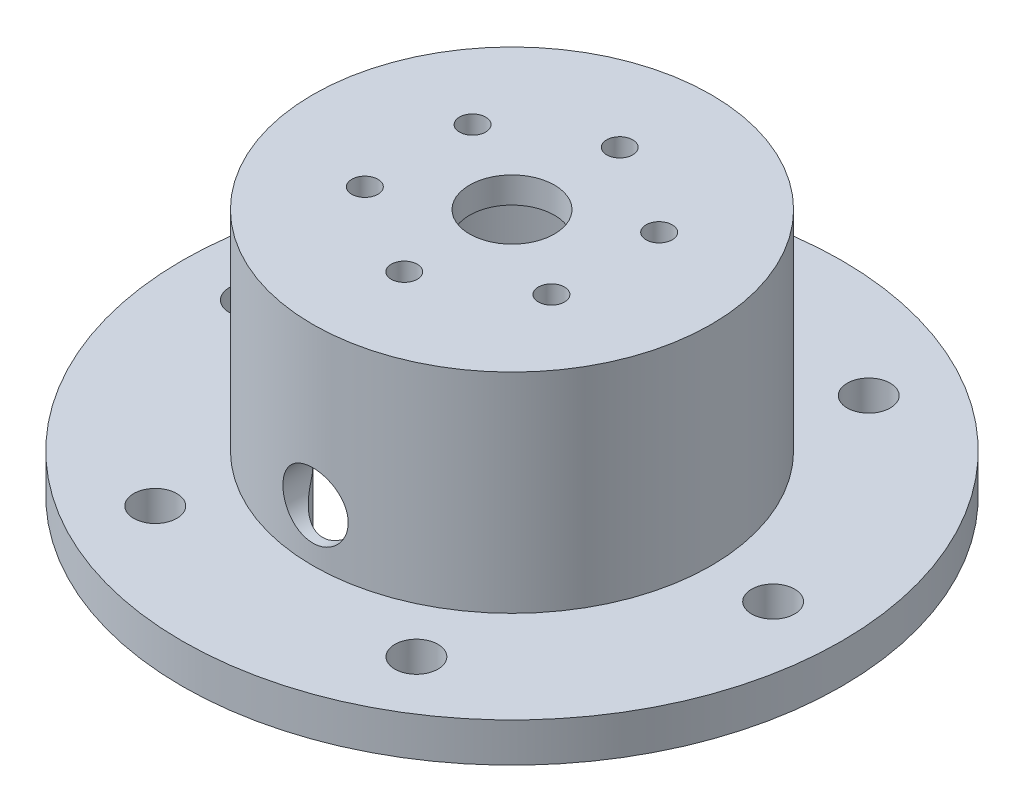
ISO-10303-21;
HEADER;
FILE_DESCRIPTION(('STEP AP214'),'2;1');
FILE_NAME('part.step','',(''),(''),'','','');
FILE_SCHEMA(('AUTOMOTIVE_DESIGN { 1 0 10303 214 1 1 1 1 }'));
ENDSEC;
DATA;
#1=APPLICATION_CONTEXT('core data for automotive mechanical design processes');
#2=APPLICATION_PROTOCOL_DEFINITION('international standard','automotive_design',2000,#1);
#3=PRODUCT_CONTEXT('',#1,'mechanical');
#4=PRODUCT('Part','Part','',(#3));
#5=PRODUCT_RELATED_PRODUCT_CATEGORY('part','',(#4));
#6=PRODUCT_DEFINITION_FORMATION('','',#4);
#7=PRODUCT_DEFINITION_CONTEXT('part definition',#1,'design');
#8=PRODUCT_DEFINITION('design','',#6,#7);
#9=PRODUCT_DEFINITION_SHAPE('','',#8);
#10=(LENGTH_UNIT() NAMED_UNIT(*) SI_UNIT(.MILLI.,.METRE.));
#11=(NAMED_UNIT(*) PLANE_ANGLE_UNIT() SI_UNIT($,.RADIAN.));
#12=(NAMED_UNIT(*) SI_UNIT($,.STERADIAN.) SOLID_ANGLE_UNIT());
#13=UNCERTAINTY_MEASURE_WITH_UNIT(LENGTH_MEASURE(1.E-05),#10,'distance_accuracy_value','');
#14=(GEOMETRIC_REPRESENTATION_CONTEXT(3) GLOBAL_UNCERTAINTY_ASSIGNED_CONTEXT((#13)) GLOBAL_UNIT_ASSIGNED_CONTEXT((#10,
#11,#12)) REPRESENTATION_CONTEXT('',''));
#15=CARTESIAN_POINT('',(0.,0.,0.));
#16=DIRECTION('',(0.,0.,1.));
#17=DIRECTION('',(1.,0.,0.));
#18=AXIS2_PLACEMENT_3D('',#15,#16,#17);
#19=CARTESIAN_POINT('',(0.,-8.78125000000001,0.));
#20=DIRECTION('',(0.,-1.,0.));
#21=DIRECTION('',(0.,0.,-1.));
#22=AXIS2_PLACEMENT_3D('',#19,#20,#21);
#23=CYLINDRICAL_SURFACE('',#22,15.25);
#24=CARTESIAN_POINT('',(0.,-5.5,0.));
#25=DIRECTION('',(0.,-1.,0.));
#26=DIRECTION('',(0.,0.,-1.));
#27=AXIS2_PLACEMENT_3D('',#24,#25,#26);
#28=CIRCLE('',#27,15.25);
#29=CARTESIAN_POINT('',(0.,-5.5,-15.25));
#30=VERTEX_POINT('',#29);
#31=EDGE_CURVE('E203',#30,#30,#28,.T.);
#32=ORIENTED_EDGE('',*,*,#31,.F.);
#33=EDGE_LOOP('',(#32));
#34=FACE_BOUND('',#33,.T.);
#35=CARTESIAN_POINT('',(0.,10.5,0.));
#36=DIRECTION('',(0.,-1.,0.));
#37=DIRECTION('',(0.,0.,-1.));
#38=AXIS2_PLACEMENT_3D('',#35,#36,#37);
#39=CIRCLE('',#38,15.25);
#40=CARTESIAN_POINT('',(0.,10.5,-15.25));
#41=VERTEX_POINT('',#40);
#42=EDGE_CURVE('E207',#41,#41,#39,.T.);
#43=ORIENTED_EDGE('',*,*,#42,.T.);
#44=EDGE_LOOP('',(#43));
#45=FACE_BOUND('',#44,.T.);
#46=CARTESIAN_POINT('',(-2.5,-1.5,15.0436863833304));
#47=CARTESIAN_POINT('',(-2.49999436889565,-1.36058996622969,15.0436888715291));
#48=CARTESIAN_POINT('',(-2.48829942423912,-1.22110298129269,15.0456452510416));
#49=CARTESIAN_POINT('',(-2.44184762292878,-0.946040401480073,15.0532525701983));
#50=CARTESIAN_POINT('',(-2.40706928890944,-0.810468572063246,15.0589069504835));
#51=CARTESIAN_POINT('',(-2.31552901295923,-0.547256998718041,15.0732530335271));
#52=CARTESIAN_POINT('',(-2.2587851865163,-0.419610818712108,15.0819422328191));
#53=CARTESIAN_POINT('',(-2.12496938402168,-0.17566552473177,15.1013759391912));
#54=CARTESIAN_POINT('',(-2.04789978249932,-0.0593650874800335,15.1121202061508));
#55=CARTESIAN_POINT('',(-1.87483569025007,0.159711486861906,15.1345679860233));
#56=CARTESIAN_POINT('',(-1.77868524100701,0.262363679005608,15.146278905572));
#57=CARTESIAN_POINT('',(-1.57052580853765,0.450153707589076,15.1692746165885));
#58=CARTESIAN_POINT('',(-1.45851589793393,0.535290519107398,15.1805593830882));
#59=CARTESIAN_POINT('',(-1.22101550420704,0.686096941257241,15.201509533958));
#60=CARTESIAN_POINT('',(-1.09545097283345,0.751651400947113,15.2111651995828));
#61=CARTESIAN_POINT('',(-0.834907894641405,0.86069232466309,15.2276868590877));
#62=CARTESIAN_POINT('',(-0.699929940845753,0.904180177406113,15.2345530285136));
#63=CARTESIAN_POINT('',(-0.425671427665323,0.967474896221933,15.2446697835583));
#64=CARTESIAN_POINT('',(-0.286440094823517,0.987489903632927,15.2479521298532));
#65=CARTESIAN_POINT('',(-0.00655927461231981,1.00391785068276,15.2506404830936));
#66=CARTESIAN_POINT('',(0.134090118751873,1.00033234469361,15.2500467453249));
#67=CARTESIAN_POINT('',(0.411391944086977,0.969823696491157,15.2450750106367));
#68=CARTESIAN_POINT('',(0.548069763342836,0.943124542232166,15.240733335087));
#69=CARTESIAN_POINT('',(0.814978708892734,0.867498999726815,15.2287940466321));
#70=CARTESIAN_POINT('',(0.945209643751341,0.818571951878227,15.221196337106));
#71=CARTESIAN_POINT('',(1.19619618959688,0.699655736846042,15.2035367187676));
#72=CARTESIAN_POINT('',(1.3169071190836,0.629573933518881,15.1934640088286));
#73=CARTESIAN_POINT('',(1.54494009188738,0.470405400765909,15.171974083687));
#74=CARTESIAN_POINT('',(1.65226108495578,0.381317182042463,15.1605567631554));
#75=CARTESIAN_POINT('',(1.85179060195157,0.185421439999782,15.1374897684758));
#76=CARTESIAN_POINT('',(1.94380692799787,0.0784181835354853,15.1258389400893));
#77=CARTESIAN_POINT('',(2.10860979061517,-0.149609767352113,15.1037478707327));
#78=CARTESIAN_POINT('',(2.18139616079641,-0.270634583085807,15.093307640238));
#79=CARTESIAN_POINT('',(2.30570873414623,-0.523489246494777,15.0748194098191));
#80=CARTESIAN_POINT('',(2.35721237516533,-0.655330384225065,15.0667739511428));
#81=CARTESIAN_POINT('',(2.43728923713707,-0.925953897143515,15.0540287328452));
#82=CARTESIAN_POINT('',(2.46586440749228,-1.06473568116462,15.049328688797));
#83=CARTESIAN_POINT('',(2.49900375018269,-1.34358297133288,15.0438613069689));
#84=CARTESIAN_POINT('',(2.50384164158102,-1.48361509741253,15.0430491400149));
#85=CARTESIAN_POINT('',(2.49009798194966,-1.76248861370057,15.045330129843));
#86=CARTESIAN_POINT('',(2.47151730483556,-1.90133004814759,15.0484231408949));
#87=CARTESIAN_POINT('',(2.41169711181135,-2.1730151717221,15.0581246046451));
#88=CARTESIAN_POINT('',(2.37059641649807,-2.30589026393369,15.0647115119862));
#89=CARTESIAN_POINT('',(2.26704827509519,-2.56286646578566,15.0806405632024));
#90=CARTESIAN_POINT('',(2.20459958947363,-2.68696706544612,15.0899828670601));
#91=CARTESIAN_POINT('',(2.05948015817447,-2.92409123313138,15.1104744800114));
#92=CARTESIAN_POINT('',(1.976633701866,-3.03700591200682,15.121639189897));
#93=CARTESIAN_POINT('',(1.79331213199657,-3.24742834826989,15.1444723610906));
#94=CARTESIAN_POINT('',(1.69283582035502,-3.34493505771427,15.1561408565939));
#95=CARTESIAN_POINT('',(1.47589522888507,-3.5227703929993,15.1788083647533));
#96=CARTESIAN_POINT('',(1.35928052089206,-3.60291667117805,15.1897994771961));
#97=CARTESIAN_POINT('',(1.11408312890344,-3.74248000300532,15.2097477606053));
#98=CARTESIAN_POINT('',(0.985500822384892,-3.8018977101854,15.2187049956929));
#99=CARTESIAN_POINT('',(0.720564626536504,-3.89803218944689,15.2335419023291));
#100=CARTESIAN_POINT('',(0.584246386342421,-3.93484511147779,15.2394345923668));
#101=CARTESIAN_POINT('',(0.307258234990384,-3.9850349186343,15.2475334351947));
#102=CARTESIAN_POINT('',(0.166588670666615,-3.99841366677137,15.2497398810398));
#103=CARTESIAN_POINT('',(-0.1133475924258,-4.00130313113405,15.2502136927576));
#104=CARTESIAN_POINT('',(-0.252611425539534,-3.99109155755358,15.2485268909664));
#105=CARTESIAN_POINT('',(-0.527412134154975,-3.94768999727634,15.2414971045484));
#106=CARTESIAN_POINT('',(-0.662949028887985,-3.91450012917256,15.2361541387914));
#107=CARTESIAN_POINT('',(-0.926347478650721,-3.82618933835013,15.2224101182014));
#108=CARTESIAN_POINT('',(-1.0542168780381,-3.77109128542064,15.2140122531306));
#109=CARTESIAN_POINT('',(-1.29893912405276,-3.64055884010791,15.1950761389678));
#110=CARTESIAN_POINT('',(-1.41579147570313,-3.56512353459419,15.1845377937748));
#111=CARTESIAN_POINT('',(-1.6365632571551,-3.3950700154789,15.1623423178756));
#112=CARTESIAN_POINT('',(-1.74032471080974,-3.30024813966821,15.1506740657498));
#113=CARTESIAN_POINT('',(-1.93056179840912,-3.09454084298458,15.127611755094));
#114=CARTESIAN_POINT('',(-2.01703337766477,-2.9836516646215,15.1162177614307));
#115=CARTESIAN_POINT('',(-2.1707759377247,-2.74806100641487,15.0949102160576));
#116=CARTESIAN_POINT('',(-2.23791198284988,-2.62327050516041,15.0850072881624));
#117=CARTESIAN_POINT('',(-2.35016654005215,-2.36407333255384,15.0679284794768));
#118=CARTESIAN_POINT('',(-2.39530719424081,-2.22967648860596,15.0607498578247));
#119=CARTESIAN_POINT('',(-2.45241030429398,-1.99561843946267,15.0515359076239));
#120=CARTESIAN_POINT('',(-2.4702280370176,-1.89737953492528,15.0486085721035));
#121=CARTESIAN_POINT('',(-2.49402479746069,-1.69944019949075,15.0446829364593));
#122=CARTESIAN_POINT('',(-2.50000402872857,-1.59973979375201,15.0436846031685));
#123=CARTESIAN_POINT('',(-2.5,-1.5,15.0436863833304));
#124=B_SPLINE_CURVE_WITH_KNOTS('',3,(#46,#47,#48,#49,#50,#51,#52,#53,#54,#55,#56,#57,#58,#59,
#60,#61,#62,#63,#64,#65,#66,#67,#68,#69,#70,#71,#72,#73,#74,#75,#76,#77,#78,#79,#80,#81,#82,#83,
#84,#85,#86,#87,#88,#89,#90,#91,#92,#93,#94,#95,#96,#97,#98,#99,#100,#101,#102,#103,#104,#105,
#106,#107,#108,#109,#110,#111,#112,#113,#114,#115,#116,#117,#118,#119,#120,#121,#122,#123),
.UNSPECIFIED.,.T.,.F.,(4,2,2,2,2,2,2,2,2,2,2,2,2,2,2,2,2,2,2,2,2,2,2,2,2,2,2,2,2,2,2,2,2,2,2,2,
2,2,4),(0.,0.417865400343386,0.836120139194291,1.25403066535855,1.67189239133825,
2.09332172555459,2.51477571291411,2.93866129896237,3.36252020532592,3.78259149670449,
4.20263512171375,4.6186532153536,5.03468365494004,5.45256298124069,5.87047506360856,
6.29329309485534,6.71611478447214,7.1393835710122,7.56261636698263,7.98095712600443,
8.39928227417968,8.81505727870983,9.23085642855569,9.65037100640883,10.0699141044662,
10.4936705305046,10.9174135951187,11.3393415427163,11.7612359456162,12.1781890678994,
12.595140038267,13.0116568945588,13.4281924553239,13.8493521868335,14.2706105699595,
14.6947412241392,15.1184440318466,15.4174076310667,15.7163660899322),.UNSPECIFIED.);
#125=CARTESIAN_POINT('',(-2.5,-1.5,15.0436863833304));
#126=VERTEX_POINT('',#125);
#127=EDGE_CURVE('E106',#126,#126,#124,.T.);
#128=ORIENTED_EDGE('',*,*,#127,.T.);
#129=EDGE_LOOP('',(#128));
#130=FACE_BOUND('',#129,.T.);
#131=ADVANCED_FACE('F39',(#34,#45,#130),#23,.T.);
#132=CARTESIAN_POINT('',(0.,-8.78125000000001,0.));
#133=DIRECTION('',(0.,-1.,0.));
#134=DIRECTION('',(0.,0.,-1.));
#135=AXIS2_PLACEMENT_3D('',#132,#133,#134);
#136=CYLINDRICAL_SURFACE('',#135,13.);
#137=DIRECTION('',(0.,-1.,0.));
#138=VECTOR('',#137,1.);
#139=CARTESIAN_POINT('',(2.5,1.5,12.7573508221731));
#140=LINE('',#139,#138);
#141=CARTESIAN_POINT('',(2.5,-1.5,12.7573508221731));
#142=VERTEX_POINT('',#141);
#143=CARTESIAN_POINT('',(2.5,-8.5,12.7573508221731));
#144=VERTEX_POINT('',#143);
#145=EDGE_CURVE('E63',#142,#144,#140,.T.);
#146=ORIENTED_EDGE('',*,*,#145,.F.);
#147=CARTESIAN_POINT('',(2.5,1.5,12.7573508221731));
#148=VERTEX_POINT('',#147);
#149=EDGE_CURVE('E98',#148,#142,#140,.T.);
#150=ORIENTED_EDGE('',*,*,#149,.F.);
#151=CARTESIAN_POINT('',(0.,1.5,0.));
#152=DIRECTION('',(0.,1.,0.));
#153=DIRECTION('',(0.,0.,-1.));
#154=AXIS2_PLACEMENT_3D('',#151,#152,#153);
#155=CIRCLE('',#154,13.);
#156=CARTESIAN_POINT('',(-2.5,1.5,12.7573508221731));
#157=VERTEX_POINT('',#156);
#158=EDGE_CURVE('E91',#157,#148,#155,.T.);
#159=ORIENTED_EDGE('',*,*,#158,.F.);
#160=DIRECTION('',(0.,-1.,0.));
#161=VECTOR('',#160,1.);
#162=CARTESIAN_POINT('',(-2.5,1.5,12.7573508221731));
#163=LINE('',#162,#161);
#164=CARTESIAN_POINT('',(-2.5,-1.5,12.7573508221731));
#165=VERTEX_POINT('',#164);
#166=EDGE_CURVE('E77',#157,#165,#163,.T.);
#167=ORIENTED_EDGE('',*,*,#166,.T.);
#168=CARTESIAN_POINT('',(-2.5,-8.5,12.7573508221731));
#169=VERTEX_POINT('',#168);
#170=EDGE_CURVE('E87',#165,#169,#163,.T.);
#171=ORIENTED_EDGE('',*,*,#170,.T.);
#172=CARTESIAN_POINT('',(0.,-8.5,0.));
#173=DIRECTION('',(0.,-1.,0.));
#174=DIRECTION('',(0.,0.,-1.));
#175=AXIS2_PLACEMENT_3D('',#172,#173,#174);
#176=CIRCLE('',#175,13.);
#177=EDGE_CURVE('E262',#169,#144,#176,.T.);
#178=ORIENTED_EDGE('',*,*,#177,.T.);
#179=EDGE_LOOP('',(#146,#150,#159,#167,#171,#178));
#180=FACE_BOUND('',#179,.T.);
#181=CARTESIAN_POINT('',(0.,8.5,0.));
#182=DIRECTION('',(0.,-1.,0.));
#183=DIRECTION('',(0.,0.,-1.));
#184=AXIS2_PLACEMENT_3D('',#181,#182,#183);
#185=CIRCLE('',#184,13.);
#186=CARTESIAN_POINT('',(0.,8.5,-13.));
#187=VERTEX_POINT('',#186);
#188=EDGE_CURVE('E260',#187,#187,#185,.T.);
#189=ORIENTED_EDGE('',*,*,#188,.F.);
#190=EDGE_LOOP('',(#189));
#191=FACE_BOUND('',#190,.T.);
#192=ADVANCED_FACE('F96',(#180,#191),#136,.F.);
#193=CARTESIAN_POINT('',(13.,8.5,0.));
#194=DIRECTION('',(0.,-1.,0.));
#195=DIRECTION('',(0.,0.,-1.));
#196=AXIS2_PLACEMENT_3D('',#193,#194,#195);
#197=PLANE('',#196);
#198=CARTESIAN_POINT('',(7.14470958122166,8.5,4.12499999999993));
#199=DIRECTION('',(0.,-1.,0.));
#200=DIRECTION('',(0.,0.,-1.));
#201=AXIS2_PLACEMENT_3D('',#198,#199,#200);
#202=CIRCLE('',#201,1.);
#203=CARTESIAN_POINT('',(7.14470958122166,8.5,3.12499999999993));
#204=VERTEX_POINT('',#203);
#205=EDGE_CURVE('E237',#204,#204,#202,.T.);
#206=ORIENTED_EDGE('',*,*,#205,.F.);
#207=EDGE_LOOP('',(#206));
#208=FACE_BOUND('',#207,.T.);
#209=CARTESIAN_POINT('',(7.14470958122157,8.5,-4.12500000000008));
#210=DIRECTION('',(0.,-1.,0.));
#211=DIRECTION('',(0.,0.,-1.));
#212=AXIS2_PLACEMENT_3D('',#209,#210,#211);
#213=CIRCLE('',#212,1.);
#214=CARTESIAN_POINT('',(7.14470958122157,8.5,-5.12500000000008));
#215=VERTEX_POINT('',#214);
#216=EDGE_CURVE('E241',#215,#215,#213,.T.);
#217=ORIENTED_EDGE('',*,*,#216,.F.);
#218=EDGE_LOOP('',(#217));
#219=FACE_BOUND('',#218,.T.);
#220=CARTESIAN_POINT('',(-7.1447095812216,8.5,4.12500000000003));
#221=DIRECTION('',(0.,-1.,0.));
#222=DIRECTION('',(0.,0.,-1.));
#223=AXIS2_PLACEMENT_3D('',#220,#221,#222);
#224=CIRCLE('',#223,1.);
#225=CARTESIAN_POINT('',(-7.1447095812216,8.5,3.12500000000003));
#226=VERTEX_POINT('',#225);
#227=EDGE_CURVE('E245',#226,#226,#224,.T.);
#228=ORIENTED_EDGE('',*,*,#227,.F.);
#229=EDGE_LOOP('',(#228));
#230=FACE_BOUND('',#229,.T.);
#231=CARTESIAN_POINT('',(0.,8.5,8.25));
#232=DIRECTION('',(0.,-1.,0.));
#233=DIRECTION('',(0.,0.,-1.));
#234=AXIS2_PLACEMENT_3D('',#231,#232,#233);
#235=CIRCLE('',#234,1.);
#236=CARTESIAN_POINT('',(0.,8.5,7.25));
#237=VERTEX_POINT('',#236);
#238=EDGE_CURVE('E249',#237,#237,#235,.T.);
#239=ORIENTED_EDGE('',*,*,#238,.F.);
#240=EDGE_LOOP('',(#239));
#241=FACE_BOUND('',#240,.T.);
#242=CARTESIAN_POINT('',(-7.14470958122163,8.5,-4.12499999999998));
#243=DIRECTION('',(0.,-1.,0.));
#244=DIRECTION('',(0.,0.,-1.));
#245=AXIS2_PLACEMENT_3D('',#242,#243,#244);
#246=CIRCLE('',#245,1.);
#247=CARTESIAN_POINT('',(-7.14470958122163,8.5,-5.12499999999998));
#248=VERTEX_POINT('',#247);
#249=EDGE_CURVE('E253',#248,#248,#246,.T.);
#250=ORIENTED_EDGE('',*,*,#249,.F.);
#251=EDGE_LOOP('',(#250));
#252=FACE_BOUND('',#251,.T.);
#253=CARTESIAN_POINT('',(0.,8.5,-8.25));
#254=DIRECTION('',(0.,-1.,0.));
#255=DIRECTION('',(0.,0.,-1.));
#256=AXIS2_PLACEMENT_3D('',#253,#254,#255);
#257=CIRCLE('',#256,1.);
#258=CARTESIAN_POINT('',(0.,8.5,-9.25));
#259=VERTEX_POINT('',#258);
#260=EDGE_CURVE('E257',#259,#259,#257,.T.);
#261=ORIENTED_EDGE('',*,*,#260,.F.);
#262=EDGE_LOOP('',(#261));
#263=FACE_BOUND('',#262,.T.);
#264=ORIENTED_EDGE('',*,*,#188,.T.);
#265=EDGE_LOOP('',(#264));
#266=FACE_BOUND('',#265,.T.);
#267=CARTESIAN_POINT('',(0.,8.5,0.));
#268=DIRECTION('',(0.,-1.,0.));
#269=DIRECTION('',(0.,0.,-1.));
#270=AXIS2_PLACEMENT_3D('',#267,#268,#269);
#271=CIRCLE('',#270,3.25);
#272=CARTESIAN_POINT('',(0.,8.5,-3.25));
#273=VERTEX_POINT('',#272);
#274=EDGE_CURVE('E217',#273,#273,#271,.T.);
#275=ORIENTED_EDGE('',*,*,#274,.F.);
#276=EDGE_LOOP('',(#275));
#277=FACE_BOUND('',#276,.T.);
#278=ADVANCED_FACE('F41',(#208,#219,#230,#241,#252,#263,#266,#277),#197,.T.);
#279=CARTESIAN_POINT('',(0.,-8.78125000000001,0.));
#280=DIRECTION('',(0.,-1.,0.));
#281=DIRECTION('',(0.,0.,-1.));
#282=AXIS2_PLACEMENT_3D('',#279,#280,#281);
#283=CYLINDRICAL_SURFACE('',#282,3.25);
#284=ORIENTED_EDGE('',*,*,#274,.T.);
#285=EDGE_LOOP('',(#284));
#286=FACE_BOUND('',#285,.T.);
#287=CARTESIAN_POINT('',(0.,10.5,0.));
#288=DIRECTION('',(0.,-1.,0.));
#289=DIRECTION('',(0.,0.,-1.));
#290=AXIS2_PLACEMENT_3D('',#287,#288,#289);
#291=CIRCLE('',#290,3.25);
#292=CARTESIAN_POINT('',(0.,10.5,-3.25));
#293=VERTEX_POINT('',#292);
#294=EDGE_CURVE('E212',#293,#293,#291,.T.);
#295=ORIENTED_EDGE('',*,*,#294,.F.);
#296=EDGE_LOOP('',(#295));
#297=FACE_BOUND('',#296,.T.);
#298=ADVANCED_FACE('F192',(#286,#297),#283,.F.);
#299=CARTESIAN_POINT('',(3.25,10.5,0.));
#300=DIRECTION('',(0.,1.,0.));
#301=DIRECTION('',(0.,0.,1.));
#302=AXIS2_PLACEMENT_3D('',#299,#300,#301);
#303=PLANE('',#302);
#304=CARTESIAN_POINT('',(7.14470958122166,10.5,4.12499999999993));
#305=DIRECTION('',(0.,1.,0.));
#306=DIRECTION('',(-0.866025403784443,0.,-0.499999999999992));
#307=AXIS2_PLACEMENT_3D('',#304,#305,#306);
#308=CIRCLE('',#307,1.);
#309=CARTESIAN_POINT('',(6.27868417743721,10.5,3.62499999999994));
#310=VERTEX_POINT('',#309);
#311=EDGE_CURVE('E344',#310,#310,#308,.T.);
#312=ORIENTED_EDGE('',*,*,#311,.F.);
#313=EDGE_LOOP('',(#312));
#314=FACE_BOUND('',#313,.T.);
#315=CARTESIAN_POINT('',(7.14470958122157,10.5,-4.12500000000008));
#316=DIRECTION('',(0.,1.,0.));
#317=DIRECTION('',(-0.866025403784433,0.,0.50000000000001));
#318=AXIS2_PLACEMENT_3D('',#315,#316,#317);
#319=CIRCLE('',#318,1.);
#320=CARTESIAN_POINT('',(6.27868417743714,10.5,-3.62500000000007));
#321=VERTEX_POINT('',#320);
#322=EDGE_CURVE('E352',#321,#321,#319,.T.);
#323=ORIENTED_EDGE('',*,*,#322,.F.);
#324=EDGE_LOOP('',(#323));
#325=FACE_BOUND('',#324,.T.);
#326=CARTESIAN_POINT('',(-7.1447095812216,10.5,4.12500000000003));
#327=DIRECTION('',(0.,1.,0.));
#328=DIRECTION('',(0.866025403784436,0.,-0.500000000000004));
#329=AXIS2_PLACEMENT_3D('',#326,#327,#328);
#330=CIRCLE('',#329,1.);
#331=CARTESIAN_POINT('',(-6.27868417743716,10.5,3.62500000000003));
#332=VERTEX_POINT('',#331);
#333=EDGE_CURVE('E328',#332,#332,#330,.T.);
#334=ORIENTED_EDGE('',*,*,#333,.F.);
#335=EDGE_LOOP('',(#334));
#336=FACE_BOUND('',#335,.T.);
#337=CARTESIAN_POINT('',(0.,10.5,8.25));
#338=DIRECTION('',(0.,1.,0.));
#339=DIRECTION('',(0.,0.,-1.));
#340=AXIS2_PLACEMENT_3D('',#337,#338,#339);
#341=CIRCLE('',#340,1.);
#342=CARTESIAN_POINT('',(0.,10.5,7.25));
#343=VERTEX_POINT('',#342);
#344=EDGE_CURVE('E336',#343,#343,#341,.T.);
#345=ORIENTED_EDGE('',*,*,#344,.F.);
#346=EDGE_LOOP('',(#345));
#347=FACE_BOUND('',#346,.T.);
#348=CARTESIAN_POINT('',(-7.14470958122163,10.5,-4.12499999999998));
#349=DIRECTION('',(0.,1.,0.));
#350=DIRECTION('',(0.86602540378444,0.,0.499999999999998));
#351=AXIS2_PLACEMENT_3D('',#348,#349,#350);
#352=CIRCLE('',#351,1.);
#353=CARTESIAN_POINT('',(-6.27868417743719,10.5,-3.62499999999999));
#354=VERTEX_POINT('',#353);
#355=EDGE_CURVE('E323',#354,#354,#352,.T.);
#356=ORIENTED_EDGE('',*,*,#355,.F.);
#357=EDGE_LOOP('',(#356));
#358=FACE_BOUND('',#357,.T.);
#359=CARTESIAN_POINT('',(0.,10.5,-8.25));
#360=DIRECTION('',(0.,1.,0.));
#361=DIRECTION('',(0.,0.,1.));
#362=AXIS2_PLACEMENT_3D('',#359,#360,#361);
#363=CIRCLE('',#362,1.);
#364=CARTESIAN_POINT('',(0.,10.5,-7.25));
#365=VERTEX_POINT('',#364);
#366=EDGE_CURVE('E285',#365,#365,#363,.T.);
#367=ORIENTED_EDGE('',*,*,#366,.F.);
#368=EDGE_LOOP('',(#367));
#369=FACE_BOUND('',#368,.T.);
#370=ORIENTED_EDGE('',*,*,#294,.T.);
#371=EDGE_LOOP('',(#370));
#372=FACE_BOUND('',#371,.T.);
#373=ORIENTED_EDGE('',*,*,#42,.F.);
#374=EDGE_LOOP('',(#373));
#375=FACE_BOUND('',#374,.T.);
#376=ADVANCED_FACE('F187',(#314,#325,#336,#347,#358,#369,#372,#375),#303,.T.);
#377=CARTESIAN_POINT('',(15.25,-5.5,0.));
#378=DIRECTION('',(0.,1.,0.));
#379=DIRECTION('',(0.,0.,1.));
#380=AXIS2_PLACEMENT_3D('',#377,#378,#379);
#381=PLANE('',#380);
#382=CARTESIAN_POINT('',(-20.,-5.5,0.));
#383=DIRECTION('',(0.,1.,0.));
#384=DIRECTION('',(0.,0.,1.));
#385=AXIS2_PLACEMENT_3D('',#382,#383,#384);
#386=CIRCLE('',#385,1.65);
#387=CARTESIAN_POINT('',(-20.,-5.5,1.65));
#388=VERTEX_POINT('',#387);
#389=EDGE_CURVE('E303',#388,#388,#386,.T.);
#390=ORIENTED_EDGE('',*,*,#389,.F.);
#391=EDGE_LOOP('',(#390));
#392=FACE_BOUND('',#391,.T.);
#393=CARTESIAN_POINT('',(-9.99999999999984,-5.5,17.3205080756889));
#394=DIRECTION('',(0.,1.,0.));
#395=DIRECTION('',(0.,0.,1.));
#396=AXIS2_PLACEMENT_3D('',#393,#394,#395);
#397=CIRCLE('',#396,1.65);
#398=CARTESIAN_POINT('',(-9.99999999999984,-5.5,18.9705080756889));
#399=VERTEX_POINT('',#398);
#400=EDGE_CURVE('E307',#399,#399,#397,.T.);
#401=ORIENTED_EDGE('',*,*,#400,.F.);
#402=EDGE_LOOP('',(#401));
#403=FACE_BOUND('',#402,.T.);
#404=CARTESIAN_POINT('',(9.99999999999996,-5.5,-17.3205080756888));
#405=DIRECTION('',(0.,1.,0.));
#406=DIRECTION('',(0.,0.,1.));
#407=AXIS2_PLACEMENT_3D('',#404,#405,#406);
#408=CIRCLE('',#407,1.65);
#409=CARTESIAN_POINT('',(9.99999999999996,-5.5,-15.6705080756888));
#410=VERTEX_POINT('',#409);
#411=EDGE_CURVE('E311',#410,#410,#408,.T.);
#412=ORIENTED_EDGE('',*,*,#411,.F.);
#413=EDGE_LOOP('',(#412));
#414=FACE_BOUND('',#413,.T.);
#415=CARTESIAN_POINT('',(-10.0000000000001,-5.5,-17.3205080756887));
#416=DIRECTION('',(0.,1.,0.));
#417=DIRECTION('',(0.,0.,1.));
#418=AXIS2_PLACEMENT_3D('',#415,#416,#417);
#419=CIRCLE('',#418,1.65);
#420=CARTESIAN_POINT('',(-10.0000000000001,-5.5,-15.6705080756887));
#421=VERTEX_POINT('',#420);
#422=EDGE_CURVE('E315',#421,#421,#419,.T.);
#423=ORIENTED_EDGE('',*,*,#422,.F.);
#424=EDGE_LOOP('',(#423));
#425=FACE_BOUND('',#424,.T.);
#426=CARTESIAN_POINT('',(10.0000000000002,-5.5,17.3205080756887));
#427=DIRECTION('',(0.,1.,0.));
#428=DIRECTION('',(0.,0.,1.));
#429=AXIS2_PLACEMENT_3D('',#426,#427,#428);
#430=CIRCLE('',#429,1.65);
#431=CARTESIAN_POINT('',(10.0000000000002,-5.5,18.9705080756887));
#432=VERTEX_POINT('',#431);
#433=EDGE_CURVE('E319',#432,#432,#430,.T.);
#434=ORIENTED_EDGE('',*,*,#433,.F.);
#435=EDGE_LOOP('',(#434));
#436=FACE_BOUND('',#435,.T.);
#437=CARTESIAN_POINT('',(20.,-5.5,0.));
#438=DIRECTION('',(0.,1.,0.));
#439=DIRECTION('',(0.,0.,1.));
#440=AXIS2_PLACEMENT_3D('',#437,#438,#439);
#441=CIRCLE('',#440,1.65);
#442=CARTESIAN_POINT('',(20.,-5.5,1.65));
#443=VERTEX_POINT('',#442);
#444=EDGE_CURVE('E269',#443,#443,#441,.T.);
#445=ORIENTED_EDGE('',*,*,#444,.F.);
#446=EDGE_LOOP('',(#445));
#447=FACE_BOUND('',#446,.T.);
#448=ORIENTED_EDGE('',*,*,#31,.T.);
#449=EDGE_LOOP('',(#448));
#450=FACE_BOUND('',#449,.T.);
#451=CARTESIAN_POINT('',(0.,-5.5,0.));
#452=DIRECTION('',(0.,-1.,0.));
#453=DIRECTION('',(0.,0.,-1.));
#454=AXIS2_PLACEMENT_3D('',#451,#452,#453);
#455=CIRCLE('',#454,25.25);
#456=CARTESIAN_POINT('',(0.,-5.5,-25.25));
#457=VERTEX_POINT('',#456);
#458=EDGE_CURVE('E219',#457,#457,#455,.T.);
#459=ORIENTED_EDGE('',*,*,#458,.F.);
#460=EDGE_LOOP('',(#459));
#461=FACE_BOUND('',#460,.T.);
#462=ADVANCED_FACE('F184',(#392,#403,#414,#425,#436,#447,#450,#461),#381,.T.);
#463=CARTESIAN_POINT('',(0.,-8.78125000000001,0.));
#464=DIRECTION('',(0.,-1.,0.));
#465=DIRECTION('',(0.,0.,-1.));
#466=AXIS2_PLACEMENT_3D('',#463,#464,#465);
#467=CYLINDRICAL_SURFACE('',#466,25.25);
#468=ORIENTED_EDGE('',*,*,#458,.T.);
#469=EDGE_LOOP('',(#468));
#470=FACE_BOUND('',#469,.T.);
#471=CARTESIAN_POINT('',(0.,-8.5,0.));
#472=DIRECTION('',(0.,-1.,0.));
#473=DIRECTION('',(0.,0.,-1.));
#474=AXIS2_PLACEMENT_3D('',#471,#472,#473);
#475=CIRCLE('',#474,25.25);
#476=CARTESIAN_POINT('',(0.,-8.5,-25.25));
#477=VERTEX_POINT('',#476);
#478=EDGE_CURVE('E267',#477,#477,#475,.T.);
#479=ORIENTED_EDGE('',*,*,#478,.F.);
#480=EDGE_LOOP('',(#479));
#481=FACE_BOUND('',#480,.T.);
#482=ADVANCED_FACE('F181',(#470,#481),#467,.T.);
#483=CARTESIAN_POINT('',(25.25,-8.5,0.));
#484=DIRECTION('',(0.,-1.,0.));
#485=DIRECTION('',(0.,0.,-1.));
#486=AXIS2_PLACEMENT_3D('',#483,#484,#485);
#487=PLANE('',#486);
#488=CARTESIAN_POINT('',(0.,-8.5,11.8354286464699));
#489=DIRECTION('',(0.,-1.,0.));
#490=DIRECTION('',(0.,0.,-1.));
#491=AXIS2_PLACEMENT_3D('',#488,#489,#490);
#492=CIRCLE('',#491,2.66457135353011);
#493=EDGE_CURVE('E94',#144,#169,#492,.T.);
#494=ORIENTED_EDGE('',*,*,#493,.F.);
#495=ORIENTED_EDGE('',*,*,#177,.F.);
#496=EDGE_LOOP('',(#494,#495));
#497=FACE_BOUND('',#496,.T.);
#498=CARTESIAN_POINT('',(-20.,-8.5,0.));
#499=DIRECTION('',(0.,1.,0.));
#500=DIRECTION('',(0.,0.,-1.));
#501=AXIS2_PLACEMENT_3D('',#498,#499,#500);
#502=CIRCLE('',#501,1.65);
#503=CARTESIAN_POINT('',(-20.,-8.5,-1.65));
#504=VERTEX_POINT('',#503);
#505=EDGE_CURVE('E340',#504,#504,#502,.T.);
#506=ORIENTED_EDGE('',*,*,#505,.T.);
#507=EDGE_LOOP('',(#506));
#508=FACE_BOUND('',#507,.T.);
#509=CARTESIAN_POINT('',(-9.99999999999984,-8.5,17.3205080756889));
#510=DIRECTION('',(0.,1.,0.));
#511=DIRECTION('',(-0.866025403784443,0.,-0.499999999999992));
#512=AXIS2_PLACEMENT_3D('',#509,#510,#511);
#513=CIRCLE('',#512,1.65);
#514=CARTESIAN_POINT('',(-11.4289419162442,-8.5,16.4955080756889));
#515=VERTEX_POINT('',#514);
#516=EDGE_CURVE('E348',#515,#515,#513,.T.);
#517=ORIENTED_EDGE('',*,*,#516,.T.);
#518=EDGE_LOOP('',(#517));
#519=FACE_BOUND('',#518,.T.);
#520=CARTESIAN_POINT('',(9.99999999999996,-8.5,-17.3205080756888));
#521=DIRECTION('',(0.,1.,0.));
#522=DIRECTION('',(0.86602540378444,0.,0.499999999999998));
#523=AXIS2_PLACEMENT_3D('',#520,#521,#522);
#524=CIRCLE('',#523,1.65);
#525=CARTESIAN_POINT('',(11.4289419162443,-8.5,-16.4955080756888));
#526=VERTEX_POINT('',#525);
#527=EDGE_CURVE('E327',#526,#526,#524,.T.);
#528=ORIENTED_EDGE('',*,*,#527,.T.);
#529=EDGE_LOOP('',(#528));
#530=FACE_BOUND('',#529,.T.);
#531=CARTESIAN_POINT('',(-10.0000000000001,-8.5,-17.3205080756887));
#532=DIRECTION('',(0.,1.,0.));
#533=DIRECTION('',(0.866025403784436,0.,-0.500000000000004));
#534=AXIS2_PLACEMENT_3D('',#531,#532,#533);
#535=CIRCLE('',#534,1.65);
#536=CARTESIAN_POINT('',(-8.57105808375576,-8.5,-18.1455080756887));
#537=VERTEX_POINT('',#536);
#538=EDGE_CURVE('E332',#537,#537,#535,.T.);
#539=ORIENTED_EDGE('',*,*,#538,.T.);
#540=EDGE_LOOP('',(#539));
#541=FACE_BOUND('',#540,.T.);
#542=CARTESIAN_POINT('',(10.0000000000002,-8.5,17.3205080756887));
#543=DIRECTION('',(0.,1.,0.));
#544=DIRECTION('',(-0.866025403784433,0.,0.50000000000001));
#545=AXIS2_PLACEMENT_3D('',#542,#543,#544);
#546=CIRCLE('',#545,1.65);
#547=CARTESIAN_POINT('',(8.57105808375589,-8.5,18.1455080756887));
#548=VERTEX_POINT('',#547);
#549=EDGE_CURVE('E115',#548,#548,#546,.T.);
#550=ORIENTED_EDGE('',*,*,#549,.T.);
#551=EDGE_LOOP('',(#550));
#552=FACE_BOUND('',#551,.T.);
#553=CARTESIAN_POINT('',(20.,-8.5,0.));
#554=DIRECTION('',(0.,1.,0.));
#555=DIRECTION('',(0.,0.,1.));
#556=AXIS2_PLACEMENT_3D('',#553,#554,#555);
#557=CIRCLE('',#556,1.65);
#558=CARTESIAN_POINT('',(20.,-8.5,1.65));
#559=VERTEX_POINT('',#558);
#560=EDGE_CURVE('E286',#559,#559,#557,.T.);
#561=ORIENTED_EDGE('',*,*,#560,.T.);
#562=EDGE_LOOP('',(#561));
#563=FACE_BOUND('',#562,.T.);
#564=ORIENTED_EDGE('',*,*,#478,.T.);
#565=EDGE_LOOP('',(#564));
#566=FACE_BOUND('',#565,.T.);
#567=ADVANCED_FACE('F175',(#497,#508,#519,#530,#541,#552,#563,#566),#487,.T.);
#568=CARTESIAN_POINT('',(20.,-8.5,0.));
#569=DIRECTION('',(0.,1.,0.));
#570=DIRECTION('',(0.,0.,1.));
#571=AXIS2_PLACEMENT_3D('',#568,#569,#570);
#572=CYLINDRICAL_SURFACE('',#571,1.65);
#573=ORIENTED_EDGE('',*,*,#444,.T.);
#574=EDGE_LOOP('',(#573));
#575=FACE_BOUND('',#574,.T.);
#576=ORIENTED_EDGE('',*,*,#560,.F.);
#577=EDGE_LOOP('',(#576));
#578=FACE_BOUND('',#577,.T.);
#579=ADVANCED_FACE('F171',(#575,#578),#572,.F.);
#580=CARTESIAN_POINT('',(0.,-8.5,-8.25));
#581=DIRECTION('',(0.,1.,0.));
#582=DIRECTION('',(0.,0.,1.));
#583=AXIS2_PLACEMENT_3D('',#580,#581,#582);
#584=CYLINDRICAL_SURFACE('',#583,1.);
#585=ORIENTED_EDGE('',*,*,#260,.T.);
#586=EDGE_LOOP('',(#585));
#587=FACE_BOUND('',#586,.T.);
#588=ORIENTED_EDGE('',*,*,#366,.T.);
#589=EDGE_LOOP('',(#588));
#590=FACE_BOUND('',#589,.T.);
#591=ADVANCED_FACE('F133',(#587,#590),#584,.F.);
#592=CARTESIAN_POINT('',(10.0000000000002,-8.5,17.3205080756887));
#593=DIRECTION('',(0.,1.,0.));
#594=DIRECTION('',(0.,0.,1.));
#595=AXIS2_PLACEMENT_3D('',#592,#593,#594);
#596=CYLINDRICAL_SURFACE('',#595,1.65);
#597=ORIENTED_EDGE('',*,*,#433,.T.);
#598=EDGE_LOOP('',(#597));
#599=FACE_BOUND('',#598,.T.);
#600=ORIENTED_EDGE('',*,*,#549,.F.);
#601=EDGE_LOOP('',(#600));
#602=FACE_BOUND('',#601,.T.);
#603=ADVANCED_FACE('F128',(#599,#602),#596,.F.);
#604=CARTESIAN_POINT('',(-10.0000000000001,-8.5,-17.3205080756887));
#605=DIRECTION('',(0.,1.,0.));
#606=DIRECTION('',(0.,0.,1.));
#607=AXIS2_PLACEMENT_3D('',#604,#605,#606);
#608=CYLINDRICAL_SURFACE('',#607,1.65);
#609=ORIENTED_EDGE('',*,*,#422,.T.);
#610=EDGE_LOOP('',(#609));
#611=FACE_BOUND('',#610,.T.);
#612=ORIENTED_EDGE('',*,*,#538,.F.);
#613=EDGE_LOOP('',(#612));
#614=FACE_BOUND('',#613,.T.);
#615=ADVANCED_FACE('F132',(#611,#614),#608,.F.);
#616=CARTESIAN_POINT('',(9.99999999999996,-8.5,-17.3205080756888));
#617=DIRECTION('',(0.,1.,0.));
#618=DIRECTION('',(0.,0.,1.));
#619=AXIS2_PLACEMENT_3D('',#616,#617,#618);
#620=CYLINDRICAL_SURFACE('',#619,1.65);
#621=ORIENTED_EDGE('',*,*,#411,.T.);
#622=EDGE_LOOP('',(#621));
#623=FACE_BOUND('',#622,.T.);
#624=ORIENTED_EDGE('',*,*,#527,.F.);
#625=EDGE_LOOP('',(#624));
#626=FACE_BOUND('',#625,.T.);
#627=ADVANCED_FACE('F139',(#623,#626),#620,.F.);
#628=CARTESIAN_POINT('',(-9.99999999999984,-8.5,17.3205080756889));
#629=DIRECTION('',(0.,1.,0.));
#630=DIRECTION('',(0.,0.,1.));
#631=AXIS2_PLACEMENT_3D('',#628,#629,#630);
#632=CYLINDRICAL_SURFACE('',#631,1.65);
#633=ORIENTED_EDGE('',*,*,#400,.T.);
#634=EDGE_LOOP('',(#633));
#635=FACE_BOUND('',#634,.T.);
#636=ORIENTED_EDGE('',*,*,#516,.F.);
#637=EDGE_LOOP('',(#636));
#638=FACE_BOUND('',#637,.T.);
#639=ADVANCED_FACE('F135',(#635,#638),#632,.F.);
#640=CARTESIAN_POINT('',(-20.,-8.5,0.));
#641=DIRECTION('',(0.,1.,0.));
#642=DIRECTION('',(0.,0.,1.));
#643=AXIS2_PLACEMENT_3D('',#640,#641,#642);
#644=CYLINDRICAL_SURFACE('',#643,1.65);
#645=ORIENTED_EDGE('',*,*,#389,.T.);
#646=EDGE_LOOP('',(#645));
#647=FACE_BOUND('',#646,.T.);
#648=ORIENTED_EDGE('',*,*,#505,.F.);
#649=EDGE_LOOP('',(#648));
#650=FACE_BOUND('',#649,.T.);
#651=ADVANCED_FACE('F138',(#647,#650),#644,.F.);
#652=CARTESIAN_POINT('',(-7.14470958122163,-8.5,-4.12499999999998));
#653=DIRECTION('',(0.,1.,0.));
#654=DIRECTION('',(0.,0.,1.));
#655=AXIS2_PLACEMENT_3D('',#652,#653,#654);
#656=CYLINDRICAL_SURFACE('',#655,1.);
#657=ORIENTED_EDGE('',*,*,#249,.T.);
#658=EDGE_LOOP('',(#657));
#659=FACE_BOUND('',#658,.T.);
#660=ORIENTED_EDGE('',*,*,#355,.T.);
#661=EDGE_LOOP('',(#660));
#662=FACE_BOUND('',#661,.T.);
#663=ADVANCED_FACE('F148',(#659,#662),#656,.F.);
#664=CARTESIAN_POINT('',(0.,-8.5,8.25));
#665=DIRECTION('',(0.,1.,0.));
#666=DIRECTION('',(0.,0.,1.));
#667=AXIS2_PLACEMENT_3D('',#664,#665,#666);
#668=CYLINDRICAL_SURFACE('',#667,1.);
#669=ORIENTED_EDGE('',*,*,#238,.T.);
#670=EDGE_LOOP('',(#669));
#671=FACE_BOUND('',#670,.T.);
#672=ORIENTED_EDGE('',*,*,#344,.T.);
#673=EDGE_LOOP('',(#672));
#674=FACE_BOUND('',#673,.T.);
#675=ADVANCED_FACE('F156',(#671,#674),#668,.F.);
#676=CARTESIAN_POINT('',(-7.1447095812216,-8.5,4.12500000000003));
#677=DIRECTION('',(0.,1.,0.));
#678=DIRECTION('',(0.,0.,1.));
#679=AXIS2_PLACEMENT_3D('',#676,#677,#678);
#680=CYLINDRICAL_SURFACE('',#679,1.);
#681=ORIENTED_EDGE('',*,*,#227,.T.);
#682=EDGE_LOOP('',(#681));
#683=FACE_BOUND('',#682,.T.);
#684=ORIENTED_EDGE('',*,*,#333,.T.);
#685=EDGE_LOOP('',(#684));
#686=FACE_BOUND('',#685,.T.);
#687=ADVANCED_FACE('F144',(#683,#686),#680,.F.);
#688=CARTESIAN_POINT('',(7.14470958122157,-8.5,-4.12500000000008));
#689=DIRECTION('',(0.,1.,0.));
#690=DIRECTION('',(0.,0.,1.));
#691=AXIS2_PLACEMENT_3D('',#688,#689,#690);
#692=CYLINDRICAL_SURFACE('',#691,1.);
#693=ORIENTED_EDGE('',*,*,#216,.T.);
#694=EDGE_LOOP('',(#693));
#695=FACE_BOUND('',#694,.T.);
#696=ORIENTED_EDGE('',*,*,#322,.T.);
#697=EDGE_LOOP('',(#696));
#698=FACE_BOUND('',#697,.T.);
#699=ADVANCED_FACE('F141',(#695,#698),#692,.F.);
#700=CARTESIAN_POINT('',(7.14470958122166,-8.5,4.12499999999993));
#701=DIRECTION('',(0.,1.,0.));
#702=DIRECTION('',(0.,0.,1.));
#703=AXIS2_PLACEMENT_3D('',#700,#701,#702);
#704=CYLINDRICAL_SURFACE('',#703,1.);
#705=ORIENTED_EDGE('',*,*,#205,.T.);
#706=EDGE_LOOP('',(#705));
#707=FACE_BOUND('',#706,.T.);
#708=ORIENTED_EDGE('',*,*,#311,.T.);
#709=EDGE_LOOP('',(#708));
#710=FACE_BOUND('',#709,.T.);
#711=ADVANCED_FACE('F124',(#707,#710),#704,.F.);
#712=CARTESIAN_POINT('',(0.,-1.5,25.25));
#713=DIRECTION('',(0.,0.,-1.));
#714=DIRECTION('',(-1.,0.,0.));
#715=AXIS2_PLACEMENT_3D('',#712,#713,#714);
#716=CYLINDRICAL_SURFACE('',#715,2.5);
#717=CARTESIAN_POINT('',(-2.5,-1.5,12.7573508221731));
#718=CARTESIAN_POINT('',(-2.49999302909629,-1.56510660270141,12.7573816159966));
#719=CARTESIAN_POINT('',(-2.49740824356102,-1.63031210259846,12.7644674053454));
#720=CARTESIAN_POINT('',(-2.48749245186113,-1.75797349921063,12.7906740415412));
#721=CARTESIAN_POINT('',(-2.48013501487611,-1.82041200268319,12.8098618928024));
#722=CARTESIAN_POINT('',(-2.45627764062423,-1.97521021169435,12.8689178256616));
#723=CARTESIAN_POINT('',(-2.43696878845278,-2.06489862541799,12.9143523681298));
#724=CARTESIAN_POINT('',(-2.39050467386812,-2.23721509046703,13.0137737140532));
#725=CARTESIAN_POINT('',(-2.36331772150813,-2.31981284453544,13.0677946523003));
#726=CARTESIAN_POINT('',(-2.30191374685172,-2.4789690535193,13.1789852781123));
#727=CARTESIAN_POINT('',(-2.26775761533835,-2.5555723606617,13.2361247478671));
#728=CARTESIAN_POINT('',(-2.19233309202638,-2.70442562250652,13.3514692309188));
#729=CARTESIAN_POINT('',(-2.15105906522649,-2.77667206639362,13.4096750555324));
#730=CARTESIAN_POINT('',(-2.06135367773765,-2.91694611607077,13.5254342003436));
#731=CARTESIAN_POINT('',(-2.0129321923492,-2.98497936180328,13.5829883047024));
#732=CARTESIAN_POINT('',(-1.90872975199873,-3.11672462138171,13.6962383683885));
#733=CARTESIAN_POINT('',(-1.85295318571538,-3.1804391780742,13.7519354111635));
#734=CARTESIAN_POINT('',(-1.70602975838953,-3.33171541844271,13.8856343570083));
#735=CARTESIAN_POINT('',(-1.6104965171425,-3.41658822300493,13.9619639998239));
#736=CARTESIAN_POINT('',(-1.40273745969153,-3.57345202525519,14.1043663189935));
#737=CARTESIAN_POINT('',(-1.2905410485929,-3.64546523265685,14.1704566529145));
#738=CARTESIAN_POINT('',(-1.07504971344664,-3.75962057753398,14.2758079841119));
#739=CARTESIAN_POINT('',(-0.974743623986359,-3.80486034005471,14.3177903840254));
#740=CARTESIAN_POINT('',(-0.76530990365923,-3.88259245996058,14.3901271373587));
#741=CARTESIAN_POINT('',(-0.656187444821612,-3.9150922265735,14.4204882491542));
#742=CARTESIAN_POINT('',(-0.430787605741386,-3.96532637185304,14.4674800908798));
#743=CARTESIAN_POINT('',(-0.314463888546897,-3.98295144723654,14.4840091719308));
#744=CARTESIAN_POINT('',(-0.0793435689310831,-4.00151599845786,14.5014203249461));
#745=CARTESIAN_POINT('',(0.0394515863174171,-4.00246497830352,14.5023113093436));
#746=CARTESIAN_POINT('',(0.261107922778604,-3.98851175146513,14.4892235920041));
#747=CARTESIAN_POINT('',(0.36419985591048,-3.97546074782585,14.4769814568285));
#748=CARTESIAN_POINT('',(0.566051042449246,-3.93724047118531,14.4411985114995));
#749=CARTESIAN_POINT('',(0.664809729506689,-3.91206961925348,14.4176562292047));
#750=CARTESIAN_POINT('',(0.858871765319507,-3.85011526725086,14.3598797060718));
#751=CARTESIAN_POINT('',(0.953974901953149,-3.81299786889316,14.3253383879678));
#752=CARTESIAN_POINT('',(1.13608544331808,-3.7292094988077,14.2477030878788));
#753=CARTESIAN_POINT('',(1.22308863443015,-3.68253359466152,14.2046046905866));
#754=CARTESIAN_POINT('',(1.43146239796481,-3.55490724756847,14.0874593380541));
#755=CARTESIAN_POINT('',(1.54716294853014,-3.46875912578087,14.0089767476612));
#756=CARTESIAN_POINT('',(1.7585225209551,-3.28256650795279,13.841857314498));
#757=CARTESIAN_POINT('',(1.85412896921951,-3.18248666993859,13.7531947506796));
#758=CARTESIAN_POINT('',(1.98400309342057,-3.02269153063487,13.61525958254));
#759=CARTESIAN_POINT('',(2.02546596772982,-2.96705794562118,13.5678348842565));
#760=CARTESIAN_POINT('',(2.10340568123459,-2.85294540666685,13.4723221731904));
#761=CARTESIAN_POINT('',(2.13988358554189,-2.79446706418243,13.4242343045289));
#762=CARTESIAN_POINT('',(2.20790078356067,-2.67469698101091,13.3282675300324));
#763=CARTESIAN_POINT('',(2.23944635558233,-2.61340894747017,13.2803884352175));
#764=CARTESIAN_POINT('',(2.29767148004959,-2.48767690130702,13.1858800520476));
#765=CARTESIAN_POINT('',(2.32435367459712,-2.42323462655784,13.1392500968956));
#766=CARTESIAN_POINT('',(2.37201743159184,-2.29260420536874,13.0503098720642));
#767=CARTESIAN_POINT('',(2.39315083095541,-2.22653319039252,13.007910236888));
#768=CARTESIAN_POINT('',(2.4304622101875,-2.08980917677836,12.9284534543373));
#769=CARTESIAN_POINT('',(2.44664304992298,-2.01915885114611,12.8913932302768));
#770=CARTESIAN_POINT('',(2.46948966546874,-1.89303303016704,12.83652224373));
#771=CARTESIAN_POINT('',(2.47755235218948,-1.83892523309688,12.8162322693696));
#772=CARTESIAN_POINT('',(2.49019971420177,-1.72803113354451,12.783666589983));
#773=CARTESIAN_POINT('',(2.49479675199324,-1.67125512662573,12.7713624204336));
#774=CARTESIAN_POINT('',(2.50006396894544,-1.55538654662456,12.7572162553325));
#775=CARTESIAN_POINT('',(2.50068297073591,-1.49627358953769,12.7555106189308));
#776=CARTESIAN_POINT('',(2.49775832617182,-1.37888791594336,12.7634123027275));
#777=CARTESIAN_POINT('',(2.49420797317139,-1.32061670623635,12.7730378498438));
#778=CARTESIAN_POINT('',(2.48204378261773,-1.19241797890286,12.8048294462729));
#779=CARTESIAN_POINT('',(2.4723776546431,-1.12326303732204,12.8295485601253));
#780=CARTESIAN_POINT('',(2.44826174077009,-0.989433057861592,12.8875418381161));
#781=CARTESIAN_POINT('',(2.43379020703736,-0.924780033702145,12.9208547393792));
#782=CARTESIAN_POINT('',(2.39921149104276,-0.793764953996674,12.9954133201165));
#783=CARTESIAN_POINT('',(2.37871696289014,-0.727764201258018,13.0371014082473));
#784=CARTESIAN_POINT('',(2.33311612054328,-0.599325462916141,13.1234126897017));
#785=CARTESIAN_POINT('',(2.30800491014828,-0.536891352919496,13.1680389665472));
#786=CARTESIAN_POINT('',(2.25325588503638,-0.414963155429773,13.2586597515189));
#787=CARTESIAN_POINT('',(2.22361297337674,-0.355472479497033,13.3046557527166));
#788=CARTESIAN_POINT('',(2.15980985247583,-0.239199198727557,13.3969384692004));
#789=CARTESIAN_POINT('',(2.12564916619956,-0.182416880730949,13.4432252146942));
#790=CARTESIAN_POINT('',(2.04777253819761,-0.0639251977603746,13.5415989123229));
#791=CARTESIAN_POINT('',(2.00338894578503,-0.00259489829278139,13.5936192841214));
#792=CARTESIAN_POINT('',(1.90856179519395,0.116537962091268,13.6961333378376));
#793=CARTESIAN_POINT('',(1.85811650073876,0.174339505068541,13.7466265771242));
#794=CARTESIAN_POINT('',(1.69762956625793,0.341705614767353,13.8943215341975));
#795=CARTESIAN_POINT('',(1.57814327740835,0.445686596882676,13.9881252156013));
#796=CARTESIAN_POINT('',(1.35447272567016,0.60428096745326,14.1326568142576));
#797=CARTESIAN_POINT('',(1.25686776482031,0.664246218491053,14.1877641920696));
#798=CARTESIAN_POINT('',(1.04980627788534,0.771884405443747,14.2871556442428));
#799=CARTESIAN_POINT('',(0.940354868370371,0.819562618376599,14.3314443645566));
#800=CARTESIAN_POINT('',(0.7682203226426,0.879833326117342,14.3875836682271));
#801=CARTESIAN_POINT('',(0.709155556714071,0.898120650524798,14.4046484693684));
#802=CARTESIAN_POINT('',(0.588908509067851,0.930443286018414,14.4348442026816));
#803=CARTESIAN_POINT('',(0.527727444295296,0.944480996935416,14.4479773550775));
#804=CARTESIAN_POINT('',(0.403781989482321,0.967981745401695,14.4699793452606));
#805=CARTESIAN_POINT('',(0.341018837365179,0.977448249578747,14.4788514144623));
#806=CARTESIAN_POINT('',(0.214511359585164,0.991594535249067,14.4921141971385));
#807=CARTESIAN_POINT('',(0.150767216165088,0.996275195187655,14.496505733018));
#808=CARTESIAN_POINT('',(-0.0216920866758919,1.00225370394904,14.5021138262219));
#809=CARTESIAN_POINT('',(-0.130777726734919,0.998918283065515,14.4989825273797));
#810=CARTESIAN_POINT('',(-0.34634400547625,0.978265142681694,14.4796159843772));
#811=CARTESIAN_POINT('',(-0.452824630423842,0.96094734947694,14.4633806711423));
#812=CARTESIAN_POINT('',(-0.655939674837241,0.914569119039446,14.4200021785367));
#813=CARTESIAN_POINT('',(-0.752799595108205,0.88602945708962,14.3933430122192));
#814=CARTESIAN_POINT('',(-0.939696270834428,0.818803988863893,14.3307528210849));
#815=CARTESIAN_POINT('',(-1.0297311554672,0.78011541352167,14.2948192658533));
#816=CARTESIAN_POINT('',(-1.23946980772512,0.675496083680221,14.1980896856942));
#817=CARTESIAN_POINT('',(-1.35506178898718,0.605033312302637,14.1332755051379));
#818=CARTESIAN_POINT('',(-1.56941547394783,0.450510196285658,13.9926008740813));
#819=CARTESIAN_POINT('',(-1.66812977554336,0.366412806170922,13.916710386773));
#820=CARTESIAN_POINT('',(-1.81858692590542,0.217525649899796,13.7845540239682));
#821=CARTESIAN_POINT('',(-1.87500851338161,0.155663949781269,13.7301955594745));
#822=CARTESIAN_POINT('',(-1.9806454878472,0.0277198198627151,13.6194786925846));
#823=CARTESIAN_POINT('',(-2.02986103765337,-0.0383625145257501,13.5631203354107));
#824=CARTESIAN_POINT('',(-2.12125394031216,-0.174480432520228,13.4495936920789));
#825=CARTESIAN_POINT('',(-2.16343478239591,-0.244514033081114,13.3924258227985));
#826=CARTESIAN_POINT('',(-2.24090801474455,-0.388681260146242,13.2786858820249));
#827=CARTESIAN_POINT('',(-2.27620514563343,-0.46281201957404,13.2221134260681));
#828=CARTESIAN_POINT('',(-2.3364114645628,-0.60745990962811,13.117747272463));
#829=CARTESIAN_POINT('',(-2.36203663865639,-0.67747557809996,13.0696730106734));
#830=CARTESIAN_POINT('',(-2.40760325528361,-0.822346007711018,12.9782196867894));
#831=CARTESIAN_POINT('',(-2.42754928964054,-0.897196799022797,12.9348368491857));
#832=CARTESIAN_POINT('',(-2.45615893187591,-1.03045213571128,12.8689286640947));
#833=CARTESIAN_POINT('',(-2.46641662917739,-1.08730026066058,12.8440081112293));
#834=CARTESIAN_POINT('',(-2.48315286685963,-1.20434810915639,12.8020766976622));
#835=CARTESIAN_POINT('',(-2.48964542798751,-1.26453447176359,12.7850365403334));
#836=CARTESIAN_POINT('',(-2.49593203591834,-1.35456416324192,12.7683250321421));
#837=CARTESIAN_POINT('',(-2.49745192379322,-1.38348176222037,12.7642370353584));
#838=CARTESIAN_POINT('',(-2.49948725590285,-1.44159301895407,12.7587435929012));
#839=CARTESIAN_POINT('',(-2.50000312785665,-1.47078655382988,12.7573370049307));
#840=CARTESIAN_POINT('',(-2.5,-1.5,12.7573508221731));
#841=B_SPLINE_CURVE_WITH_KNOTS('',3,(#717,#718,#719,#720,#721,#722,#723,#724,#725,#726,#727,
#728,#729,#730,#731,#732,#733,#734,#735,#736,#737,#738,#739,#740,#741,#742,#743,#744,#745,#746,
#747,#748,#749,#750,#751,#752,#753,#754,#755,#756,#757,#758,#759,#760,#761,#762,#763,#764,#765,
#766,#767,#768,#769,#770,#771,#772,#773,#774,#775,#776,#777,#778,#779,#780,#781,#782,#783,#784,
#785,#786,#787,#788,#789,#790,#791,#792,#793,#794,#795,#796,#797,#798,#799,#800,#801,#802,#803,
#804,#805,#806,#807,#808,#809,#810,#811,#812,#813,#814,#815,#816,#817,#818,#819,#820,#821,#822,
#823,#824,#825,#826,#827,#828,#829,#830,#831,#832,#833,#834,#835,#836,#837,#838,#839,#840),
.UNSPECIFIED.,.T.,.F.,(4,2,2,2,2,2,2,2,2,2,2,2,2,2,2,2,2,2,2,2,2,2,2,2,2,2,2,2,2,2,2,2,2,2,2,2,
2,2,2,2,2,2,2,2,2,2,2,2,2,2,2,2,2,2,2,2,2,2,2,2,2,4),(0.,0.19515785808278,0.391405830150858,
0.696794942235778,1.00342996309184,1.3074925311777,1.61179692989648,1.91568475446739,
2.2193920668473,2.6643328269124,3.10849754007728,3.46043752053174,3.81217251772615,
4.1664701958809,4.52056594684085,4.83301487892856,5.1455045267655,5.46762217266536,
5.78990645975596,6.27986696789243,6.77109386029697,7.02306392518996,7.27498006853464,
7.52657289330686,7.77802862649025,8.02164201171229,8.2651144552604,8.43964632605989,
8.61355263010489,8.78969183142017,8.96611475125328,9.18709081118122,9.40908089195284,
9.6508572880019,9.8928915937213,10.135200153281,10.3775343188306,10.6528005291423,
10.9281457738071,11.4768612822191,11.8569741547483,12.2369235039036,12.429104762809,
12.6211772902808,12.8131039276638,13.0049953304403,13.3306649358675,13.656336257989,
13.96840255764,14.2805540913119,14.7283689274193,15.1774215270225,15.4765485014299,
15.7756687161715,16.0746401224875,16.3734049026035,16.6392590227076,16.9048975741718,
17.0931977232854,17.2807920948545,17.3683970947353,17.4559647659886),.UNSPECIFIED.);
#842=EDGE_CURVE('E11',#165,#142,#841,.T.);
#843=ORIENTED_EDGE('',*,*,#842,.F.);
#844=EDGE_CURVE('E43',#142,#165,#841,.T.);
#845=ORIENTED_EDGE('',*,*,#844,.F.);
#846=EDGE_LOOP('',(#843,#845));
#847=FACE_BOUND('',#846,.T.);
#848=ORIENTED_EDGE('',*,*,#127,.F.);
#849=EDGE_LOOP('',(#848));
#850=FACE_BOUND('',#849,.T.);
#851=ADVANCED_FACE('F120',(#847,#850),#716,.F.);
#852=CARTESIAN_POINT('',(0.,1.5,11.8354286464699));
#853=DIRECTION('',(0.,-1.,0.));
#854=DIRECTION('',(0.,0.,-1.));
#855=AXIS2_PLACEMENT_3D('',#852,#853,#854);
#856=CYLINDRICAL_SURFACE('',#855,2.66457135353011);
#857=ORIENTED_EDGE('',*,*,#844,.T.);
#858=ORIENTED_EDGE('',*,*,#166,.F.);
#859=CARTESIAN_POINT('',(0.,1.5,11.8354286464699));
#860=DIRECTION('',(0.,-1.,0.));
#861=DIRECTION('',(0.,0.,-1.));
#862=AXIS2_PLACEMENT_3D('',#859,#860,#861);
#863=CIRCLE('',#862,2.66457135353011);
#864=EDGE_CURVE('E80',#148,#157,#863,.T.);
#865=ORIENTED_EDGE('',*,*,#864,.F.);
#866=ORIENTED_EDGE('',*,*,#149,.T.);
#867=EDGE_LOOP('',(#857,#858,#865,#866));
#868=FACE_BOUND('',#867,.T.);
#869=ADVANCED_FACE('F79',(#868),#856,.F.);
#870=CARTESIAN_POINT('',(0.,1.5,5.91771432323494));
#871=DIRECTION('',(0.,-1.,0.));
#872=DIRECTION('',(0.,0.,-1.));
#873=AXIS2_PLACEMENT_3D('',#870,#871,#872);
#874=PLANE('',#873);
#875=ORIENTED_EDGE('',*,*,#864,.T.);
#876=ORIENTED_EDGE('',*,*,#158,.T.);
#877=EDGE_LOOP('',(#875,#876));
#878=FACE_BOUND('',#877,.T.);
#879=ADVANCED_FACE('F90',(#878),#874,.T.);
#880=ORIENTED_EDGE('',*,*,#842,.T.);
#881=ORIENTED_EDGE('',*,*,#145,.T.);
#882=ORIENTED_EDGE('',*,*,#493,.T.);
#883=ORIENTED_EDGE('',*,*,#170,.F.);
#884=EDGE_LOOP('',(#880,#881,#882,#883));
#885=FACE_BOUND('',#884,.T.);
#886=ADVANCED_FACE('F408',(#885),#856,.F.);
#887=CLOSED_SHELL('',(#131,#192,#278,#298,#376,#462,#482,#567,#579,#591,#603,#615,#627,#639,
#651,#663,#675,#687,#699,#711,#851,#869,#879,#886));
#888=MANIFOLD_SOLID_BREP('B2',#887);
#889=ADVANCED_BREP_SHAPE_REPRESENTATION('',(#18,#888),#14);
#890=SHAPE_DEFINITION_REPRESENTATION(#9,#889);
ENDSEC;
END-ISO-10303-21;
